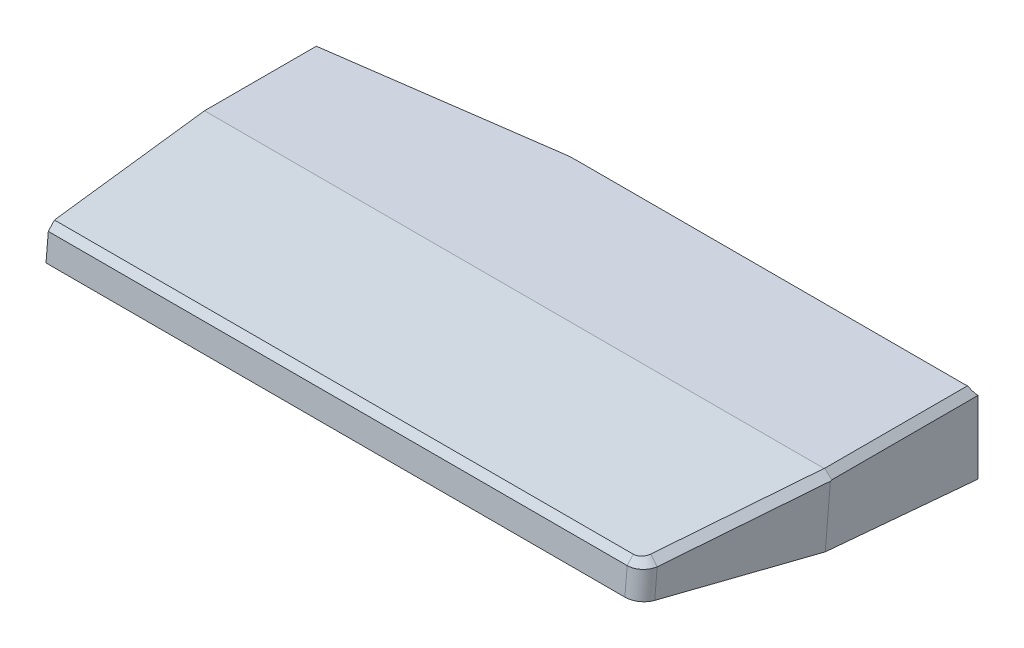
ISO-10303-21;
HEADER;
FILE_DESCRIPTION(('STEP AP214'),'2;1');
FILE_NAME('part.step','',(''),(''),'','','');
FILE_SCHEMA(('AUTOMOTIVE_DESIGN { 1 0 10303 214 1 1 1 1 }'));
ENDSEC;
DATA;
#1=APPLICATION_CONTEXT('core data for automotive mechanical design processes');
#2=APPLICATION_PROTOCOL_DEFINITION('international standard','automotive_design',2000,#1);
#3=PRODUCT_CONTEXT('',#1,'mechanical');
#4=PRODUCT('Part','Part','',(#3));
#5=PRODUCT_RELATED_PRODUCT_CATEGORY('part','',(#4));
#6=PRODUCT_DEFINITION_FORMATION('','',#4);
#7=PRODUCT_DEFINITION_CONTEXT('part definition',#1,'design');
#8=PRODUCT_DEFINITION('design','',#6,#7);
#9=PRODUCT_DEFINITION_SHAPE('','',#8);
#10=(LENGTH_UNIT() NAMED_UNIT(*) SI_UNIT(.MILLI.,.METRE.));
#11=(NAMED_UNIT(*) PLANE_ANGLE_UNIT() SI_UNIT($,.RADIAN.));
#12=(NAMED_UNIT(*) SI_UNIT($,.STERADIAN.) SOLID_ANGLE_UNIT());
#13=UNCERTAINTY_MEASURE_WITH_UNIT(LENGTH_MEASURE(1.E-05),#10,'distance_accuracy_value','');
#14=(GEOMETRIC_REPRESENTATION_CONTEXT(3) GLOBAL_UNCERTAINTY_ASSIGNED_CONTEXT((#13)) GLOBAL_UNIT_ASSIGNED_CONTEXT((#10,
#11,#12)) REPRESENTATION_CONTEXT('',''));
#15=CARTESIAN_POINT('',(0.,0.,0.));
#16=DIRECTION('',(0.,0.,1.));
#17=DIRECTION('',(1.,0.,0.));
#18=AXIS2_PLACEMENT_3D('',#15,#16,#17);
#19=CARTESIAN_POINT('',(348.213934060173,-392.518773560111,105.931813114433));
#20=DIRECTION('',(1.,0.,0.));
#21=DIRECTION('',(0.,0.,-1.));
#22=AXIS2_PLACEMENT_3D('',#19,#20,#21);
#23=PLANE('',#22);
#24=DIRECTION('',(0.,1.,0.));
#25=VECTOR('',#24,1.);
#26=CARTESIAN_POINT('',(348.213934060173,-392.518773560111,17.3508636292026));
#27=LINE('',#26,#25);
#28=CARTESIAN_POINT('',(348.213934060173,-16.3382244657723,17.3508636292026));
#29=VERTEX_POINT('',#28);
#30=CARTESIAN_POINT('',(348.213934060173,5.00000000000006,17.3508636292026));
#31=VERTEX_POINT('',#30);
#32=EDGE_CURVE('E170',#29,#31,#27,.T.);
#33=ORIENTED_EDGE('',*,*,#32,.T.);
#34=DIRECTION('',(0.,0.,1.));
#35=VECTOR('',#34,1.);
#36=CARTESIAN_POINT('',(348.213934060173,5.00000000000006,105.931813114433));
#37=LINE('',#36,#35);
#38=CARTESIAN_POINT('',(348.213934060173,5.00000000000006,60.4095629339724));
#39=VERTEX_POINT('',#38);
#40=EDGE_CURVE('E359',#31,#39,#37,.T.);
#41=ORIENTED_EDGE('',*,*,#40,.T.);
#42=DIRECTION('',(0.,-0.331657517635309,0.943399857428432));
#43=VECTOR('',#42,1.);
#44=CARTESIAN_POINT('',(348.213934060173,-52.9690159169842,225.302437189531));
#45=LINE('',#44,#43);
#46=CARTESIAN_POINT('',(348.213934060173,4.86005218566501,60.8076445123202));
#47=VERTEX_POINT('',#46);
#48=EDGE_CURVE('E363',#39,#47,#45,.T.);
#49=ORIENTED_EDGE('',*,*,#48,.T.);
#50=DIRECTION('',(0.,-0.996194698091746,0.0871557427476516));
#51=VECTOR('',#50,1.);
#52=CARTESIAN_POINT('',(348.213934060173,10.7568400959438,60.2917424189542));
#53=LINE('',#52,#51);
#54=CARTESIAN_POINT('',(348.213934060173,-12.4041043346582,62.3180624931856));
#55=VERTEX_POINT('',#54);
#56=EDGE_CURVE('E154',#47,#55,#53,.T.);
#57=ORIENTED_EDGE('',*,*,#56,.T.);
#58=DIRECTION('',(0.,0.0871557427476516,0.996194698091746));
#59=VECTOR('',#58,1.);
#60=CARTESIAN_POINT('',(348.213934060173,-11.5047781456363,72.5974078709506));
#61=LINE('',#60,#59);
#62=EDGE_CURVE('E172',#29,#55,#61,.T.);
#63=ORIENTED_EDGE('',*,*,#62,.F.);
#64=EDGE_LOOP('',(#33,#41,#49,#57,#63));
#65=FACE_BOUND('',#64,.T.);
#66=ADVANCED_FACE('F35',(#65),#23,.T.);
#67=CARTESIAN_POINT('',(345.213934060173,7.,13.9967616629529));
#68=DIRECTION('',(0.,1.,0.));
#69=DIRECTION('',(0.,0.,1.));
#70=AXIS2_PLACEMENT_3D('',#67,#68,#69);
#71=PLANE('',#70);
#72=DIRECTION('',(0.,0.,-1.));
#73=VECTOR('',#72,1.);
#74=CARTESIAN_POINT('',(163.792269218127,7.,17.3508636292026));
#75=LINE('',#74,#73);
#76=CARTESIAN_POINT('',(163.792269218127,7.,60.620423338029));
#77=VERTEX_POINT('',#76);
#78=CARTESIAN_POINT('',(163.792269218127,7.,27.7132447920053));
#79=VERTEX_POINT('',#78);
#80=EDGE_CURVE('E131',#77,#79,#75,.T.);
#81=ORIENTED_EDGE('',*,*,#80,.F.);
#82=DIRECTION('',(1.,0.,0.));
#83=VECTOR('',#82,1.);
#84=CARTESIAN_POINT('',(-20.6293956239181,7.,60.6204233380291));
#85=LINE('',#84,#83);
#86=CARTESIAN_POINT('',(346.167664025048,7.,60.6204233380289));
#87=VERTEX_POINT('',#86);
#88=EDGE_CURVE('E140',#77,#87,#85,.T.);
#89=ORIENTED_EDGE('',*,*,#88,.T.);
#90=DIRECTION('',(0.327684023558458,0.,-0.944787373277469));
#91=VECTOR('',#90,1.);
#92=CARTESIAN_POINT('',(360.499555513162,7.,19.2983290652897));
#93=LINE('',#92,#91);
#94=CARTESIAN_POINT('',(346.213934060173,7.,60.4870163306568));
#95=VERTEX_POINT('',#94);
#96=EDGE_CURVE('E494',#87,#95,#93,.T.);
#97=ORIENTED_EDGE('',*,*,#96,.T.);
#98=DIRECTION('',(0.,0.,-1.));
#99=VECTOR('',#98,1.);
#100=CARTESIAN_POINT('',(346.213934060173,7.,13.9967616629529));
#101=LINE('',#100,#99);
#102=CARTESIAN_POINT('',(346.213934060173,7.,18.384243856649));
#103=VERTEX_POINT('',#102);
#104=EDGE_CURVE('E495',#95,#103,#101,.T.);
#105=ORIENTED_EDGE('',*,*,#104,.T.);
#106=CARTESIAN_POINT('',(345.213934060173,7.,13.9967616629529));
#107=DIRECTION('',(0.,-1.,0.));
#108=DIRECTION('',(0.,0.,1.));
#109=AXIS2_PLACEMENT_3D('',#106,#107,#108);
#110=CIRCLE('',#109,4.5);
#111=CARTESIAN_POINT('',(345.213934060173,7.,18.4967616629529));
#112=VERTEX_POINT('',#111);
#113=EDGE_CURVE('E166',#103,#112,#110,.T.);
#114=ORIENTED_EDGE('',*,*,#113,.T.);
#115=DIRECTION('',(-1.,0.,0.));
#116=VECTOR('',#115,1.);
#117=CARTESIAN_POINT('',(345.213934060173,7.,18.4967616629529));
#118=LINE('',#117,#116);
#119=CARTESIAN_POINT('',(231.363868361844,7.,18.4967616629529));
#120=VERTEX_POINT('',#119);
#121=EDGE_CURVE('E179',#112,#120,#118,.T.);
#122=ORIENTED_EDGE('',*,*,#121,.T.);
#123=CARTESIAN_POINT('',(231.363868361844,7.,46.996761662953));
#124=DIRECTION('',(0.,1.,0.));
#125=DIRECTION('',(0.,0.,1.));
#126=AXIS2_PLACEMENT_3D('',#123,#124,#125);
#127=CIRCLE('',#126,28.5);
#128=CARTESIAN_POINT('',(227.397434984482,7.,18.7741217038182));
#129=VERTEX_POINT('',#128);
#130=EDGE_CURVE('E182',#120,#129,#127,.T.);
#131=ORIENTED_EDGE('',*,*,#130,.T.);
#132=DIRECTION('',(-0.990268068741571,0.,0.139173100960059));
#133=VECTOR('',#132,1.);
#134=CARTESIAN_POINT('',(174.579364027522,7.,26.1972174834791));
#135=LINE('',#134,#133);
#136=EDGE_CURVE('E144',#129,#79,#135,.T.);
#137=ORIENTED_EDGE('',*,*,#136,.T.);
#138=EDGE_LOOP('',(#81,#89,#97,#105,#114,#122,#131,#137));
#139=FACE_BOUND('',#138,.T.);
#140=ADVANCED_FACE('F139',(#139),#71,.T.);
#141=CARTESIAN_POINT('',(0.,-17.7205902201384,1.55035075525035));
#142=DIRECTION('',(0.,0.996194698091746,-0.0871557427476516));
#143=DIRECTION('',(0.,0.0871557427476516,0.996194698091746));
#144=AXIS2_PLACEMENT_3D('',#141,#142,#143);
#145=PLANE('',#144);
#146=DIRECTION('',(1.,0.,0.));
#147=VECTOR('',#146,1.);
#148=CARTESIAN_POINT('',(-36.2764368442133,-8.46998420354422,107.285261357168));
#149=LINE('',#148,#147);
#150=CARTESIAN_POINT('',(163.792269218127,-8.46998420354374,107.285261357168));
#151=VERTEX_POINT('',#150);
#152=CARTESIAN_POINT('',(334.200396292105,-8.46998420354422,107.285261357168));
#153=VERTEX_POINT('',#152);
#154=EDGE_CURVE('E164',#151,#153,#149,.T.);
#155=ORIENTED_EDGE('',*,*,#154,.F.);
#156=DIRECTION('',(0.,-0.0871557427476516,-0.996194698091746));
#157=VECTOR('',#156,1.);
#158=CARTESIAN_POINT('',(163.792269218127,-17.7205902201384,1.55035075525035));
#159=LINE('',#158,#157);
#160=CARTESIAN_POINT('',(163.792269218127,-15.4316335868925,27.7132447920053));
#161=VERTEX_POINT('',#160);
#162=EDGE_CURVE('E488',#151,#161,#159,.T.);
#163=ORIENTED_EDGE('',*,*,#162,.T.);
#164=DIRECTION('',(0.990194669991309,-0.0121751661105524,-0.139162785438432));
#165=VECTOR('',#164,1.);
#166=CARTESIAN_POINT('',(179.123846336857,-15.6201465165358,25.558532146435));
#167=LINE('',#166,#165);
#168=CARTESIAN_POINT('',(227.397434984482,-16.2137055189717,18.7741217038181));
#169=VERTEX_POINT('',#168);
#170=EDGE_CURVE('E169',#161,#169,#167,.T.);
#171=ORIENTED_EDGE('',*,*,#170,.T.);
#172=CARTESIAN_POINT('',(231.363868361844,-13.7445444677738,46.996761662953));
#173=DIRECTION('',(0.,0.996194698091746,-0.0871557427476516));
#174=DIRECTION('',(0.,0.0871557427476516,0.996194698091746));
#175=AXIS2_PLACEMENT_3D('',#172,#173,#174);
#176=ELLIPSE('',#175,28.6088653699854,28.5);
#177=CARTESIAN_POINT('',(231.363868361844,-16.2379713782624,18.4967616629529));
#178=VERTEX_POINT('',#177);
#179=EDGE_CURVE('E167',#169,#178,#176,.F.);
#180=ORIENTED_EDGE('',*,*,#179,.T.);
#181=DIRECTION('',(1.,0.,0.));
#182=VECTOR('',#181,1.);
#183=CARTESIAN_POINT('',(345.213934060173,-16.2379713782624,18.4967616629529));
#184=LINE('',#183,#182);
#185=CARTESIAN_POINT('',(345.213934060173,-16.2379713782624,18.4967616629529));
#186=VERTEX_POINT('',#185);
#187=EDGE_CURVE('E177',#178,#186,#184,.T.);
#188=ORIENTED_EDGE('',*,*,#187,.T.);
#189=CARTESIAN_POINT('',(345.213934060173,-16.6316703641291,13.9967616629529));
#190=DIRECTION('',(0.,0.996194698091746,-0.0871557427476516));
#191=DIRECTION('',(0.,0.0871557427476516,0.996194698091746));
#192=AXIS2_PLACEMENT_3D('',#189,#190,#191);
#193=ELLIPSE('',#192,4.51718926894506,4.5);
#194=EDGE_CURVE('E175',#186,#29,#193,.T.);
#195=ORIENTED_EDGE('',*,*,#194,.T.);
#196=ORIENTED_EDGE('',*,*,#62,.T.);
#197=DIRECTION('',(-0.216293898799249,0.085092618150326,0.9726130760372));
#198=VECTOR('',#197,1.);
#199=CARTESIAN_POINT('',(344.804994124381,-11.0629864119425,77.6471104939983));
#200=LINE('',#199,#198);
#201=CARTESIAN_POINT('',(339.082037792006,-8.81150664027434,103.381642042776));
#202=VERTEX_POINT('',#201);
#203=EDGE_CURVE('E150',#55,#202,#200,.T.);
#204=ORIENTED_EDGE('',*,*,#203,.T.);
#205=CARTESIAN_POINT('',(334.200396292105,-8.9057629172825,102.304287866709));
#206=DIRECTION('',(0.,0.996194698091746,-0.0871557427476516));
#207=DIRECTION('',(0.,0.0871557427476516,0.996194698091746));
#208=AXIS2_PLACEMENT_3D('',#205,#206,#207);
#209=CIRCLE('',#208,5.);
#210=EDGE_CURVE('E215',#202,#153,#209,.F.);
#211=ORIENTED_EDGE('',*,*,#210,.T.);
#212=EDGE_LOOP('',(#155,#163,#171,#180,#188,#195,#196,#204,#211));
#213=FACE_BOUND('',#212,.T.);
#214=ADVANCED_FACE('F324',(#213),#145,.F.);
#215=CARTESIAN_POINT('',(-36.2764368442133,6.99999999999999,105.931813114433));
#216=DIRECTION('',(0.,0.0871557427476512,0.996194698091746));
#217=DIRECTION('',(0.,-0.996194698091746,0.0871557427476513));
#218=AXIS2_PLACEMENT_3D('',#215,#216,#217);
#219=PLANE('',#218);
#220=DIRECTION('',(0.,0.996194698091746,-0.0871557427476513));
#221=VECTOR('',#220,1.);
#222=CARTESIAN_POINT('',(163.792269218127,6.99999999999998,105.931813114433));
#223=LINE('',#222,#221);
#224=CARTESIAN_POINT('',(163.792269218127,-0.755738745400322,106.610352331924));
#225=VERTEX_POINT('',#224);
#226=EDGE_CURVE('E50',#151,#225,#223,.T.);
#227=ORIENTED_EDGE('',*,*,#226,.F.);
#228=ORIENTED_EDGE('',*,*,#154,.T.);
#229=DIRECTION('',(0.,0.996194698091746,-0.0871557427476513));
#230=VECTOR('',#229,1.);
#231=CARTESIAN_POINT('',(334.200396292105,7.,105.931813114433));
#232=LINE('',#231,#230);
#233=CARTESIAN_POINT('',(334.200396292105,-0.755738745400526,106.610352331924));
#234=VERTEX_POINT('',#233);
#235=EDGE_CURVE('E195',#153,#234,#232,.T.);
#236=ORIENTED_EDGE('',*,*,#235,.T.);
#237=DIRECTION('',(-1.,0.,0.));
#238=VECTOR('',#237,1.);
#239=CARTESIAN_POINT('',(-6.61585785585053,-0.755738745400323,106.610352331924));
#240=LINE('',#239,#238);
#241=EDGE_CURVE('E207',#234,#225,#240,.T.);
#242=ORIENTED_EDGE('',*,*,#241,.T.);
#243=EDGE_LOOP('',(#227,#228,#236,#242));
#244=FACE_BOUND('',#243,.T.);
#245=ADVANCED_FACE('F383',(#244),#219,.T.);
#246=CARTESIAN_POINT('',(345.213934060173,-392.518773560111,13.9967616629529));
#247=DIRECTION('',(0.,1.,0.));
#248=DIRECTION('',(0.,0.,1.));
#249=AXIS2_PLACEMENT_3D('',#246,#247,#248);
#250=CYLINDRICAL_SURFACE('',#249,4.5);
#251=ORIENTED_EDGE('',*,*,#113,.F.);
#252=CARTESIAN_POINT('',(345.213934060173,7.99999999999995,13.9967616629529));
#253=DIRECTION('',(-0.707106781186535,-0.70710678118656,0.));
#254=DIRECTION('',(-0.70710678118656,0.707106781186535,0.));
#255=AXIS2_PLACEMENT_3D('',#252,#253,#254);
#256=ELLIPSE('',#255,6.36396103067882,4.5);
#257=EDGE_CURVE('E357',#103,#31,#256,.F.);
#258=ORIENTED_EDGE('',*,*,#257,.T.);
#259=ORIENTED_EDGE('',*,*,#32,.F.);
#260=ORIENTED_EDGE('',*,*,#194,.F.);
#261=DIRECTION('',(0.,1.,0.));
#262=VECTOR('',#261,1.);
#263=CARTESIAN_POINT('',(345.213934060173,-392.518773560111,18.4967616629529));
#264=LINE('',#263,#262);
#265=EDGE_CURVE('E185',#186,#112,#264,.T.);
#266=ORIENTED_EDGE('',*,*,#265,.T.);
#267=EDGE_LOOP('',(#251,#258,#259,#260,#266));
#268=FACE_BOUND('',#267,.T.);
#269=ADVANCED_FACE('F235',(#268),#250,.F.);
#270=CARTESIAN_POINT('',(174.579364027522,-392.518773560111,26.1972174834791));
#271=DIRECTION('',(-0.139173100960059,0.,-0.990268068741571));
#272=DIRECTION('',(-0.990268068741571,0.,0.139173100960059));
#273=AXIS2_PLACEMENT_3D('',#270,#271,#272);
#274=PLANE('',#273);
#275=DIRECTION('',(0.,-1.,0.));
#276=VECTOR('',#275,1.);
#277=CARTESIAN_POINT('',(163.792269218127,-392.518773560111,27.7132447920052));
#278=LINE('',#277,#276);
#279=EDGE_CURVE('E160',#79,#161,#278,.T.);
#280=ORIENTED_EDGE('',*,*,#279,.F.);
#281=ORIENTED_EDGE('',*,*,#136,.F.);
#282=DIRECTION('',(0.,1.,0.));
#283=VECTOR('',#282,1.);
#284=CARTESIAN_POINT('',(227.397434984482,-392.518773560111,18.7741217038181));
#285=LINE('',#284,#283);
#286=EDGE_CURVE('E188',#169,#129,#285,.T.);
#287=ORIENTED_EDGE('',*,*,#286,.F.);
#288=ORIENTED_EDGE('',*,*,#170,.F.);
#289=EDGE_LOOP('',(#280,#281,#287,#288));
#290=FACE_BOUND('',#289,.T.);
#291=ADVANCED_FACE('F328',(#290),#274,.T.);
#292=CARTESIAN_POINT('',(231.363868361844,-392.518773560111,46.9967616629529));
#293=DIRECTION('',(0.,1.,0.));
#294=DIRECTION('',(0.,0.,1.));
#295=AXIS2_PLACEMENT_3D('',#292,#293,#294);
#296=CYLINDRICAL_SURFACE('',#295,28.5);
#297=ORIENTED_EDGE('',*,*,#179,.F.);
#298=ORIENTED_EDGE('',*,*,#286,.T.);
#299=ORIENTED_EDGE('',*,*,#130,.F.);
#300=DIRECTION('',(0.,1.,0.));
#301=VECTOR('',#300,1.);
#302=CARTESIAN_POINT('',(231.363868361844,-392.518773560111,18.4967616629529));
#303=LINE('',#302,#301);
#304=EDGE_CURVE('E190',#178,#120,#303,.T.);
#305=ORIENTED_EDGE('',*,*,#304,.F.);
#306=EDGE_LOOP('',(#297,#298,#299,#305));
#307=FACE_BOUND('',#306,.T.);
#308=ADVANCED_FACE('F331',(#307),#296,.T.);
#309=CARTESIAN_POINT('',(345.213934060173,-392.518773560111,18.4967616629529));
#310=DIRECTION('',(0.,0.,-1.));
#311=DIRECTION('',(0.,1.,0.));
#312=AXIS2_PLACEMENT_3D('',#309,#310,#311);
#313=PLANE('',#312);
#314=ORIENTED_EDGE('',*,*,#187,.F.);
#315=ORIENTED_EDGE('',*,*,#304,.T.);
#316=ORIENTED_EDGE('',*,*,#121,.F.);
#317=ORIENTED_EDGE('',*,*,#265,.F.);
#318=EDGE_LOOP('',(#314,#315,#316,#317));
#319=FACE_BOUND('',#318,.T.);
#320=ADVANCED_FACE('F334',(#319),#313,.T.);
#321=CARTESIAN_POINT('',(344.804994124381,12.0979580186595,75.6207904197669));
#322=DIRECTION('',(0.976328299980196,0.0188512554016339,0.215470835213404));
#323=DIRECTION('',(0.215509131337735,0.,-0.976501825041845));
#324=AXIS2_PLACEMENT_3D('',#321,#322,#323);
#325=PLANE('',#324);
#326=ORIENTED_EDGE('',*,*,#56,.F.);
#327=DIRECTION('',(-0.211453267917075,-0.1263891746359,0.969181764181542));
#328=VECTOR('',#327,1.);
#329=CARTESIAN_POINT('',(339.177597242397,-0.541118311158686,102.225083670674));
#330=LINE('',#329,#328);
#331=CARTESIAN_POINT('',(339.082037792006,-0.598235801857878,102.663073953947));
#332=VERTEX_POINT('',#331);
#333=EDGE_CURVE('E44',#47,#332,#330,.T.);
#334=ORIENTED_EDGE('',*,*,#333,.T.);
#335=DIRECTION('',(0.,0.996194698091746,-0.0871557427476512));
#336=VECTOR('',#335,1.);
#337=CARTESIAN_POINT('',(339.082037792006,14.3494377903277,101.355321968545));
#338=LINE('',#337,#336);
#339=EDGE_CURVE('E204',#332,#202,#338,.F.);
#340=ORIENTED_EDGE('',*,*,#339,.T.);
#341=ORIENTED_EDGE('',*,*,#203,.F.);
#342=EDGE_LOOP('',(#326,#334,#340,#341));
#343=FACE_BOUND('',#342,.T.);
#344=ADVANCED_FACE('F337',(#343),#325,.T.);
#345=CARTESIAN_POINT('',(-20.6293956239181,1.0228318114495,106.454747570919));
#346=DIRECTION('',(0.,-0.991603801316731,-0.129313190410758));
#347=DIRECTION('',(0.,0.129313190410758,-0.991603801316731));
#348=AXIS2_PLACEMENT_3D('',#345,#346,#347);
#349=PLANE('',#348);
#350=ORIENTED_EDGE('',*,*,#88,.F.);
#351=DIRECTION('',(0.,-0.129313190410758,0.991603801316731));
#352=VECTOR('',#351,1.);
#353=CARTESIAN_POINT('',(163.792269218127,1.02283181144948,106.454747570919));
#354=LINE('',#353,#352);
#355=CARTESIAN_POINT('',(163.792269218127,1.238336313345,104.80220862573));
#356=VERTEX_POINT('',#355);
#357=EDGE_CURVE('E128',#77,#356,#354,.T.);
#358=ORIENTED_EDGE('',*,*,#357,.T.);
#359=DIRECTION('',(1.,0.,0.));
#360=VECTOR('',#359,1.);
#361=CARTESIAN_POINT('',(334.200396292105,1.238336313345,104.802208625729));
#362=LINE('',#361,#360);
#363=CARTESIAN_POINT('',(334.200396292105,1.238336313345,104.802208625729));
#364=VERTEX_POINT('',#363);
#365=EDGE_CURVE('E211',#356,#364,#362,.T.);
#366=ORIENTED_EDGE('',*,*,#365,.T.);
#367=CARTESIAN_POINT('',(337.031702123745,1.5392819151722,102.494487334394));
#368=CARTESIAN_POINT('',(336.961097666152,1.49701208092076,102.818622313909));
#369=CARTESIAN_POINT('',(336.835818581848,1.4563617346781,103.130338680437));
#370=CARTESIAN_POINT('',(336.576911415058,1.4012134975335,103.55322826668));
#371=CARTESIAN_POINT('',(336.478847542534,1.38380112093704,103.686750444643));
#372=CARTESIAN_POINT('',(336.261981406738,1.35140788618053,103.935149348262));
#373=CARTESIAN_POINT('',(336.143184740495,1.33642849430754,104.050014830086));
#374=CARTESIAN_POINT('',(335.888242234842,1.30933010566376,104.257811614802));
#375=CARTESIAN_POINT('',(335.752102206806,1.29721172659639,104.350738181));
#376=CARTESIAN_POINT('',(335.466355788191,1.27618118919023,104.512005262644));
#377=CARTESIAN_POINT('',(335.316761419714,1.26726943731828,104.580342661208));
#378=CARTESIAN_POINT('',(334.854146144707,1.24572549841019,104.745546625697));
#379=CARTESIAN_POINT('',(334.527328674122,1.23832152696159,104.802322011177));
#380=CARTESIAN_POINT('',(334.200396292105,1.238336313345,104.802208625729));
#381=B_SPLINE_CURVE_WITH_KNOTS('',3,(#367,#368,#369,#370,#371,#372,#373,#374,#375,#376,#377,
#378,#379,#380),.UNSPECIFIED.,.F.,.F.,(4,2,2,2,2,2,4),(1.78881323273118,2.12700808794583,
2.29610551555316,2.46520294316049,2.63430037076781,2.80339779837514,3.14159265358979),.UNSPECIFIED.);
#382=CARTESIAN_POINT('',(337.031702123745,1.5392819151722,102.494487334394));
#383=VERTEX_POINT('',#382);
#384=EDGE_CURVE('E365',#364,#383,#381,.F.);
#385=ORIENTED_EDGE('',*,*,#384,.T.);
#386=DIRECTION('',(0.211453267917075,0.1263891746359,-0.969181764181542));
#387=VECTOR('',#386,1.);
#388=CARTESIAN_POINT('',(346.259157842303,7.05468739339428,60.201067609494));
#389=LINE('',#388,#387);
#390=EDGE_CURVE('E148',#383,#87,#389,.T.);
#391=ORIENTED_EDGE('',*,*,#390,.T.);
#392=EDGE_LOOP('',(#350,#358,#366,#385,#391));
#393=FACE_BOUND('',#392,.T.);
#394=ADVANCED_FACE('F146',(#393),#349,.F.);
#395=CARTESIAN_POINT('',(334.200396292105,6.56422128626174,100.950839623974));
#396=DIRECTION('',(0.,0.996194698091746,-0.0871557427476513));
#397=DIRECTION('',(0.,0.0871557427476513,0.996194698091746));
#398=AXIS2_PLACEMENT_3D('',#395,#396,#397);
#399=CYLINDRICAL_SURFACE('',#398,5.);
#400=ORIENTED_EDGE('',*,*,#339,.F.);
#401=CARTESIAN_POINT('',(334.200396292105,-0.755738745400331,106.610352331924));
#402=CARTESIAN_POINT('',(334.764082018274,-0.755746484004575,106.610546273856));
#403=CARTESIAN_POINT('',(335.327569618564,-0.751871540186918,106.513433917711));
#404=CARTESIAN_POINT('',(336.125195186788,-0.740596300510266,106.230858184323));
#405=CARTESIAN_POINT('',(336.383120724145,-0.73593224446642,106.113969400143));
#406=CARTESIAN_POINT('',(336.875795008903,-0.724925698680111,105.838127570007));
#407=CARTESIAN_POINT('',(337.110523028478,-0.71858342166219,105.679179855273));
#408=CARTESIAN_POINT('',(337.550086251134,-0.704401204175997,105.323750558677));
#409=CARTESIAN_POINT('',(337.754911434447,-0.696561586988863,105.127277078764));
#410=CARTESIAN_POINT('',(338.128824671442,-0.67960825790197,104.702399245789));
#411=CARTESIAN_POINT('',(338.297903074831,-0.67049531340381,104.474014125053));
#412=CARTESIAN_POINT('',(338.744302032016,-0.641632922215934,103.750675944126));
#413=CARTESIAN_POINT('',(338.960303980556,-0.620358149807912,103.217495755656));
#414=CARTESIAN_POINT('',(339.082037792006,-0.598235801857885,102.663073953947));
#415=B_SPLINE_CURVE_WITH_KNOTS('',3,(#401,#402,#403,#404,#405,#406,#407,#408,#409,#410,#411,
#412,#413,#414),.UNSPECIFIED.,.F.,.F.,(4,2,2,2,2,2,4),(1.78881323273118,2.12700808794583,
2.29610551555316,2.46520294316049,2.63430037076781,2.80339779837514,3.14159265358979),.UNSPECIFIED.);
#416=EDGE_CURVE('E210',#332,#234,#415,.F.);
#417=ORIENTED_EDGE('',*,*,#416,.T.);
#418=ORIENTED_EDGE('',*,*,#235,.F.);
#419=ORIENTED_EDGE('',*,*,#210,.F.);
#420=EDGE_LOOP('',(#400,#417,#418,#419));
#421=FACE_BOUND('',#420,.T.);
#422=ADVANCED_FACE('F225',(#421),#399,.T.);
#423=CARTESIAN_POINT('',(346.213934060173,7.,13.9967616629529));
#424=DIRECTION('',(-0.707106781186535,-0.70710678118656,0.));
#425=DIRECTION('',(0.,0.,-1.));
#426=AXIS2_PLACEMENT_3D('',#423,#424,#425);
#427=PLANE('',#426);
#428=ORIENTED_EDGE('',*,*,#257,.F.);
#429=ORIENTED_EDGE('',*,*,#104,.F.);
#430=DIRECTION('',(0.706841808085205,-0.706841808085181,-0.0273736494773798));
#431=VECTOR('',#430,1.);
#432=CARTESIAN_POINT('',(338.670218581642,14.5437154785299,60.7791595243734));
#433=LINE('',#432,#431);
#434=EDGE_CURVE('E151',#39,#95,#433,.F.);
#435=ORIENTED_EDGE('',*,*,#434,.F.);
#436=ORIENTED_EDGE('',*,*,#40,.F.);
#437=EDGE_LOOP('',(#428,#429,#435,#436));
#438=FACE_BOUND('',#437,.T.);
#439=ADVANCED_FACE('F38',(#438),#427,.F.);
#440=CARTESIAN_POINT('',(320.214381021278,-8.51271375585873,179.575542148307));
#441=DIRECTION('',(0.691117759678898,0.681834858804176,0.239702873524516));
#442=DIRECTION('',(-0.211453267917075,-0.1263891746359,0.969181764181542));
#443=AXIS2_PLACEMENT_3D('',#440,#441,#442);
#444=PLANE('',#443);
#445=ORIENTED_EDGE('',*,*,#96,.F.);
#446=ORIENTED_EDGE('',*,*,#390,.F.);
#447=CARTESIAN_POINT('',(339.082037792006,-0.598235801857885,102.663073953947));
#448=CARTESIAN_POINT('',(337.031702123745,1.5392819151722,102.494487334394));
#449=B_SPLINE_CURVE_WITH_KNOTS('',1,(#447,#448),.UNSPECIFIED.,.F.,.F.,(2,2),(0.,1.),.UNSPECIFIED.);
#450=EDGE_CURVE('E157',#332,#383,#449,.T.);
#451=ORIENTED_EDGE('',*,*,#450,.F.);
#452=ORIENTED_EDGE('',*,*,#333,.F.);
#453=ORIENTED_EDGE('',*,*,#48,.F.);
#454=ORIENTED_EDGE('',*,*,#434,.T.);
#455=EDGE_LOOP('',(#445,#446,#451,#452,#453,#454));
#456=FACE_BOUND('',#455,.T.);
#457=ADVANCED_FACE('F302',(#456),#444,.T.);
#458=CARTESIAN_POINT('',(339.082037792006,-0.598235801857885,102.663073953947));
#459=CARTESIAN_POINT('',(338.960303980556,-0.620358149807912,103.217495755656));
#460=CARTESIAN_POINT('',(338.744302032016,-0.641632922215934,103.750675944126));
#461=CARTESIAN_POINT('',(338.297903074831,-0.67049531340381,104.474014125053));
#462=CARTESIAN_POINT('',(338.128824671442,-0.67960825790197,104.702399245789));
#463=CARTESIAN_POINT('',(337.754911434447,-0.696561586988863,105.127277078764));
#464=CARTESIAN_POINT('',(337.550086251134,-0.704401204175997,105.323750558677));
#465=CARTESIAN_POINT('',(337.110523028478,-0.71858342166219,105.679179855273));
#466=CARTESIAN_POINT('',(336.875795008903,-0.724925698680111,105.838127570007));
#467=CARTESIAN_POINT('',(336.383120724145,-0.73593224446642,106.113969400143));
#468=CARTESIAN_POINT('',(336.125195186788,-0.740596300510266,106.230858184323));
#469=CARTESIAN_POINT('',(335.327569618564,-0.751871540186918,106.513433917711));
#470=CARTESIAN_POINT('',(334.764082018274,-0.755746484004575,106.610546273856));
#471=CARTESIAN_POINT('',(334.200396292105,-0.755738745400331,106.610352331924));
#472=CARTESIAN_POINT('',(337.031702123745,1.5392819151722,102.494487334394));
#473=CARTESIAN_POINT('',(336.961097666152,1.49701208092076,102.818622313909));
#474=CARTESIAN_POINT('',(336.835818581848,1.4563617346781,103.130338680437));
#475=CARTESIAN_POINT('',(336.576911415058,1.4012134975335,103.55322826668));
#476=CARTESIAN_POINT('',(336.478847542534,1.38380112093704,103.686750444643));
#477=CARTESIAN_POINT('',(336.261981406738,1.35140788618053,103.935149348262));
#478=CARTESIAN_POINT('',(336.143184740495,1.33642849430754,104.050014830086));
#479=CARTESIAN_POINT('',(335.888242234842,1.30933010566376,104.257811614802));
#480=CARTESIAN_POINT('',(335.752102206806,1.29721172659639,104.350738181));
#481=CARTESIAN_POINT('',(335.466355788191,1.27618118919023,104.512005262644));
#482=CARTESIAN_POINT('',(335.316761419714,1.26726943731828,104.580342661208));
#483=CARTESIAN_POINT('',(334.854146144707,1.24572549841019,104.745546625697));
#484=CARTESIAN_POINT('',(334.527328674122,1.23832152696159,104.802322011177));
#485=CARTESIAN_POINT('',(334.200396292105,1.238336313345,104.802208625729));
#486=B_SPLINE_SURFACE_WITH_KNOTS('',1,3,((#458,#459,#460,#461,#462,#463,#464,#465,#466,#467,
#468,#469,#470,#471),(#472,#473,#474,#475,#476,#477,#478,#479,#480,#481,#482,#483,#484,#485)),
.UNSPECIFIED.,.F.,.F.,.F.,(2,2),(4,2,2,2,2,2,4),(0.,1.),(1.78881323273118,2.12700808794583,
2.29610551555316,2.46520294316049,2.63430037076781,2.80339779837514,3.14159265358979),.UNSPECIFIED.);
#487=CARTESIAN_POINT('',(334.200396292105,1.238336313345,104.802208625729));
#488=CARTESIAN_POINT('',(334.200396292105,-0.755738745400331,106.610352331924));
#489=B_SPLINE_CURVE_WITH_KNOTS('',1,(#487,#488),.UNSPECIFIED.,.F.,.F.,(2,2),(0.,1.),.UNSPECIFIED.);
#490=EDGE_CURVE('E265',#234,#364,#489,.F.);
#491=ORIENTED_EDGE('',*,*,#450,.T.);
#492=ORIENTED_EDGE('',*,*,#384,.F.);
#493=ORIENTED_EDGE('',*,*,#490,.F.);
#494=ORIENTED_EDGE('',*,*,#416,.F.);
#495=EDGE_LOOP('',(#491,#492,#493,#494));
#496=FACE_BOUND('',#495,.T.);
#497=ADVANCED_FACE('F245',(#496),#486,.T.);
#498=CARTESIAN_POINT('',(-20.6293956239181,1.238336313345,104.80220862573));
#499=DIRECTION('',(0.,0.671726064503692,0.740799631659183));
#500=DIRECTION('',(-1.,0.,0.));
#501=AXIS2_PLACEMENT_3D('',#498,#499,#500);
#502=PLANE('',#501);
#503=DIRECTION('',(0.,0.740799631659183,-0.671726064503692));
#504=VECTOR('',#503,1.);
#505=CARTESIAN_POINT('',(163.792269218127,1.23833631334494,104.80220862573));
#506=LINE('',#505,#504);
#507=EDGE_CURVE('E11',#225,#356,#506,.T.);
#508=ORIENTED_EDGE('',*,*,#507,.F.);
#509=ORIENTED_EDGE('',*,*,#241,.F.);
#510=ORIENTED_EDGE('',*,*,#490,.T.);
#511=ORIENTED_EDGE('',*,*,#365,.F.);
#512=EDGE_LOOP('',(#508,#509,#510,#511));
#513=FACE_BOUND('',#512,.T.);
#514=ADVANCED_FACE('F238',(#513),#502,.T.);
#515=CARTESIAN_POINT('',(163.792269218127,-16.3382244657723,17.3508636292026));
#516=DIRECTION('',(1.,0.,0.));
#517=DIRECTION('',(0.,0.,-1.));
#518=AXIS2_PLACEMENT_3D('',#515,#516,#517);
#519=PLANE('',#518);
#520=ORIENTED_EDGE('',*,*,#279,.T.);
#521=ORIENTED_EDGE('',*,*,#162,.F.);
#522=ORIENTED_EDGE('',*,*,#226,.T.);
#523=ORIENTED_EDGE('',*,*,#507,.T.);
#524=ORIENTED_EDGE('',*,*,#357,.F.);
#525=ORIENTED_EDGE('',*,*,#80,.T.);
#526=EDGE_LOOP('',(#520,#521,#522,#523,#524,#525));
#527=FACE_BOUND('',#526,.T.);
#528=ADVANCED_FACE('F130',(#527),#519,.F.);
#529=CLOSED_SHELL('',(#66,#140,#214,#245,#269,#291,#308,#320,#344,#394,#422,#439,#457,#497,#514,#528));
#530=MANIFOLD_SOLID_BREP('B2',#529);
#531=ADVANCED_BREP_SHAPE_REPRESENTATION('',(#18,#530),#14);
#532=SHAPE_DEFINITION_REPRESENTATION(#9,#531);
ENDSEC;
END-ISO-10303-21;
